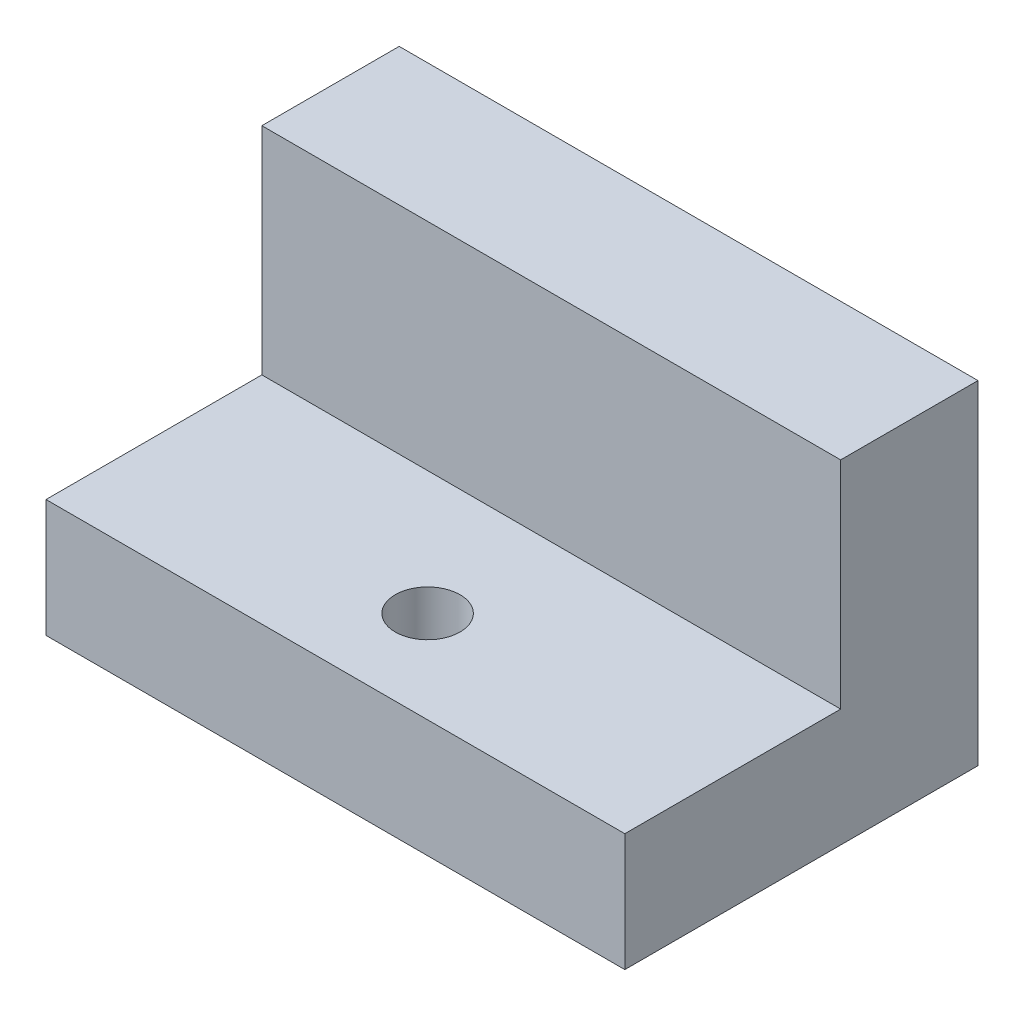
ISO-10303-21;
HEADER;
FILE_DESCRIPTION(('STEP AP214'),'2;1');
FILE_NAME('part.step','',(''),(''),'','','');
FILE_SCHEMA(('AUTOMOTIVE_DESIGN { 1 0 10303 214 1 1 1 1 }'));
ENDSEC;
DATA;
#1=APPLICATION_CONTEXT('core data for automotive mechanical design processes');
#2=APPLICATION_PROTOCOL_DEFINITION('international standard','automotive_design',2000,#1);
#3=PRODUCT_CONTEXT('',#1,'mechanical');
#4=PRODUCT('Part','Part','',(#3));
#5=PRODUCT_RELATED_PRODUCT_CATEGORY('part','',(#4));
#6=PRODUCT_DEFINITION_FORMATION('','',#4);
#7=PRODUCT_DEFINITION_CONTEXT('part definition',#1,'design');
#8=PRODUCT_DEFINITION('design','',#6,#7);
#9=PRODUCT_DEFINITION_SHAPE('','',#8);
#10=(LENGTH_UNIT() NAMED_UNIT(*) SI_UNIT(.MILLI.,.METRE.));
#11=(NAMED_UNIT(*) PLANE_ANGLE_UNIT() SI_UNIT($,.RADIAN.));
#12=(NAMED_UNIT(*) SI_UNIT($,.STERADIAN.) SOLID_ANGLE_UNIT());
#13=UNCERTAINTY_MEASURE_WITH_UNIT(LENGTH_MEASURE(1.E-05),#10,'distance_accuracy_value','');
#14=(GEOMETRIC_REPRESENTATION_CONTEXT(3) GLOBAL_UNCERTAINTY_ASSIGNED_CONTEXT((#13)) GLOBAL_UNIT_ASSIGNED_CONTEXT((#10,
#11,#12)) REPRESENTATION_CONTEXT('',''));
#15=CARTESIAN_POINT('',(0.,0.,0.));
#16=DIRECTION('',(0.,0.,1.));
#17=DIRECTION('',(1.,0.,0.));
#18=AXIS2_PLACEMENT_3D('',#15,#16,#17);
#19=CARTESIAN_POINT('',(-14.75,6.,0.));
#20=DIRECTION('',(-1.,0.,0.));
#21=DIRECTION('',(0.,0.,1.));
#22=AXIS2_PLACEMENT_3D('',#19,#20,#21);
#23=PLANE('',#22);
#24=DIRECTION('',(0.,0.,-1.));
#25=VECTOR('',#24,1.);
#26=CARTESIAN_POINT('',(-14.75,0.,0.));
#27=LINE('',#26,#25);
#28=CARTESIAN_POINT('',(-14.75,0.,4.));
#29=VERTEX_POINT('',#28);
#30=CARTESIAN_POINT('',(-14.75,0.,-14.));
#31=VERTEX_POINT('',#30);
#32=EDGE_CURVE('E89',#29,#31,#27,.T.);
#33=ORIENTED_EDGE('',*,*,#32,.F.);
#34=DIRECTION('',(0.,-1.,0.));
#35=VECTOR('',#34,1.);
#36=CARTESIAN_POINT('',(-14.75,6.,4.));
#37=LINE('',#36,#35);
#38=CARTESIAN_POINT('',(-14.75,6.,4.));
#39=VERTEX_POINT('',#38);
#40=EDGE_CURVE('E11',#39,#29,#37,.T.);
#41=ORIENTED_EDGE('',*,*,#40,.F.);
#42=DIRECTION('',(0.,0.,-1.));
#43=VECTOR('',#42,1.);
#44=CARTESIAN_POINT('',(-14.75,6.,0.));
#45=LINE('',#44,#43);
#46=CARTESIAN_POINT('',(-14.75,6.,-7.));
#47=VERTEX_POINT('',#46);
#48=EDGE_CURVE('E131',#39,#47,#45,.T.);
#49=ORIENTED_EDGE('',*,*,#48,.T.);
#50=DIRECTION('',(0.,-1.,0.));
#51=VECTOR('',#50,1.);
#52=CARTESIAN_POINT('',(-14.75,17.,-7.));
#53=LINE('',#52,#51);
#54=CARTESIAN_POINT('',(-14.75,17.,-7.));
#55=VERTEX_POINT('',#54);
#56=EDGE_CURVE('E116',#55,#47,#53,.T.);
#57=ORIENTED_EDGE('',*,*,#56,.F.);
#58=DIRECTION('',(0.,0.,1.));
#59=VECTOR('',#58,1.);
#60=CARTESIAN_POINT('',(-14.75,17.,-14.));
#61=LINE('',#60,#59);
#62=CARTESIAN_POINT('',(-14.75,17.,-14.));
#63=VERTEX_POINT('',#62);
#64=EDGE_CURVE('E92',#63,#55,#61,.T.);
#65=ORIENTED_EDGE('',*,*,#64,.F.);
#66=DIRECTION('',(0.,-1.,0.));
#67=VECTOR('',#66,1.);
#68=CARTESIAN_POINT('',(-14.75,6.,-14.));
#69=LINE('',#68,#67);
#70=EDGE_CURVE('E86',#63,#31,#69,.T.);
#71=ORIENTED_EDGE('',*,*,#70,.T.);
#72=EDGE_LOOP('',(#33,#41,#49,#57,#65,#71));
#73=FACE_BOUND('',#72,.T.);
#74=ADVANCED_FACE('F45',(#73),#23,.T.);
#75=CARTESIAN_POINT('',(0.,6.,4.));
#76=DIRECTION('',(0.,0.,-1.));
#77=DIRECTION('',(-1.,0.,0.));
#78=AXIS2_PLACEMENT_3D('',#75,#76,#77);
#79=PLANE('',#78);
#80=DIRECTION('',(1.,0.,0.));
#81=VECTOR('',#80,1.);
#82=CARTESIAN_POINT('',(0.,0.,4.));
#83=LINE('',#82,#81);
#84=CARTESIAN_POINT('',(14.75,0.,4.));
#85=VERTEX_POINT('',#84);
#86=EDGE_CURVE('E114',#29,#85,#83,.T.);
#87=ORIENTED_EDGE('',*,*,#86,.T.);
#88=DIRECTION('',(0.,-1.,0.));
#89=VECTOR('',#88,1.);
#90=CARTESIAN_POINT('',(14.75,6.,4.));
#91=LINE('',#90,#89);
#92=CARTESIAN_POINT('',(14.75,6.,4.));
#93=VERTEX_POINT('',#92);
#94=EDGE_CURVE('E53',#93,#85,#91,.T.);
#95=ORIENTED_EDGE('',*,*,#94,.F.);
#96=DIRECTION('',(1.,0.,0.));
#97=VECTOR('',#96,1.);
#98=CARTESIAN_POINT('',(0.,6.,4.));
#99=LINE('',#98,#97);
#100=EDGE_CURVE('E66',#39,#93,#99,.T.);
#101=ORIENTED_EDGE('',*,*,#100,.F.);
#102=ORIENTED_EDGE('',*,*,#40,.T.);
#103=EDGE_LOOP('',(#87,#95,#101,#102));
#104=FACE_BOUND('',#103,.T.);
#105=ADVANCED_FACE('F142',(#104),#79,.F.);
#106=CARTESIAN_POINT('',(14.75,6.,0.));
#107=DIRECTION('',(-1.,0.,0.));
#108=DIRECTION('',(0.,0.,1.));
#109=AXIS2_PLACEMENT_3D('',#106,#107,#108);
#110=PLANE('',#109);
#111=DIRECTION('',(0.,0.,-1.));
#112=VECTOR('',#111,1.);
#113=CARTESIAN_POINT('',(14.75,0.,0.));
#114=LINE('',#113,#112);
#115=CARTESIAN_POINT('',(14.75,0.,-14.));
#116=VERTEX_POINT('',#115);
#117=EDGE_CURVE('E109',#85,#116,#114,.T.);
#118=ORIENTED_EDGE('',*,*,#117,.T.);
#119=DIRECTION('',(0.,-1.,0.));
#120=VECTOR('',#119,1.);
#121=CARTESIAN_POINT('',(14.75,6.,-14.));
#122=LINE('',#121,#120);
#123=CARTESIAN_POINT('',(14.75,17.,-14.));
#124=VERTEX_POINT('',#123);
#125=EDGE_CURVE('E97',#124,#116,#122,.T.);
#126=ORIENTED_EDGE('',*,*,#125,.F.);
#127=DIRECTION('',(0.,0.,-1.));
#128=VECTOR('',#127,1.);
#129=CARTESIAN_POINT('',(14.75,17.,-14.));
#130=LINE('',#129,#128);
#131=CARTESIAN_POINT('',(14.75,17.,-7.));
#132=VERTEX_POINT('',#131);
#133=EDGE_CURVE('E159',#132,#124,#130,.T.);
#134=ORIENTED_EDGE('',*,*,#133,.F.);
#135=DIRECTION('',(0.,-1.,0.));
#136=VECTOR('',#135,1.);
#137=CARTESIAN_POINT('',(14.75,17.,-7.));
#138=LINE('',#137,#136);
#139=CARTESIAN_POINT('',(14.75,6.,-7.));
#140=VERTEX_POINT('',#139);
#141=EDGE_CURVE('E122',#132,#140,#138,.T.);
#142=ORIENTED_EDGE('',*,*,#141,.T.);
#143=DIRECTION('',(0.,0.,-1.));
#144=VECTOR('',#143,1.);
#145=CARTESIAN_POINT('',(14.75,6.,0.));
#146=LINE('',#145,#144);
#147=EDGE_CURVE('E140',#93,#140,#146,.T.);
#148=ORIENTED_EDGE('',*,*,#147,.F.);
#149=ORIENTED_EDGE('',*,*,#94,.T.);
#150=EDGE_LOOP('',(#118,#126,#134,#142,#148,#149));
#151=FACE_BOUND('',#150,.T.);
#152=ADVANCED_FACE('F138',(#151),#110,.F.);
#153=CARTESIAN_POINT('',(0.,6.,-14.));
#154=DIRECTION('',(0.,0.,1.));
#155=DIRECTION('',(1.,0.,0.));
#156=AXIS2_PLACEMENT_3D('',#153,#154,#155);
#157=PLANE('',#156);
#158=DIRECTION('',(-1.,0.,0.));
#159=VECTOR('',#158,1.);
#160=CARTESIAN_POINT('',(0.,0.,-14.));
#161=LINE('',#160,#159);
#162=EDGE_CURVE('E102',#116,#31,#161,.T.);
#163=ORIENTED_EDGE('',*,*,#162,.T.);
#164=ORIENTED_EDGE('',*,*,#70,.F.);
#165=DIRECTION('',(-1.,0.,0.));
#166=VECTOR('',#165,1.);
#167=CARTESIAN_POINT('',(-14.75,17.,-14.));
#168=LINE('',#167,#166);
#169=EDGE_CURVE('E162',#124,#63,#168,.T.);
#170=ORIENTED_EDGE('',*,*,#169,.F.);
#171=ORIENTED_EDGE('',*,*,#125,.T.);
#172=EDGE_LOOP('',(#163,#164,#170,#171));
#173=FACE_BOUND('',#172,.T.);
#174=ADVANCED_FACE('F103',(#173),#157,.F.);
#175=CARTESIAN_POINT('',(0.,6.,-0.700000000000001));
#176=DIRECTION('',(0.,-1.,0.));
#177=DIRECTION('',(0.,0.,-1.));
#178=AXIS2_PLACEMENT_3D('',#175,#176,#177);
#179=CYLINDRICAL_SURFACE('',#178,1.65);
#180=CARTESIAN_POINT('',(0.,6.,-0.700000000000001));
#181=DIRECTION('',(0.,1.,0.));
#182=DIRECTION('',(0.,0.,1.));
#183=AXIS2_PLACEMENT_3D('',#180,#181,#182);
#184=CIRCLE('',#183,1.65);
#185=CARTESIAN_POINT('',(0.,6.,0.949999999999999));
#186=VERTEX_POINT('',#185);
#187=EDGE_CURVE('E98',#186,#186,#184,.T.);
#188=ORIENTED_EDGE('',*,*,#187,.T.);
#189=EDGE_LOOP('',(#188));
#190=FACE_BOUND('',#189,.T.);
#191=CARTESIAN_POINT('',(0.,0.,-0.700000000000001));
#192=DIRECTION('',(0.,1.,0.));
#193=DIRECTION('',(0.,0.,1.));
#194=AXIS2_PLACEMENT_3D('',#191,#192,#193);
#195=CIRCLE('',#194,1.65);
#196=CARTESIAN_POINT('',(0.,0.,0.949999999999999));
#197=VERTEX_POINT('',#196);
#198=EDGE_CURVE('E108',#197,#197,#195,.T.);
#199=ORIENTED_EDGE('',*,*,#198,.F.);
#200=EDGE_LOOP('',(#199));
#201=FACE_BOUND('',#200,.T.);
#202=ADVANCED_FACE('F180',(#190,#201),#179,.F.);
#203=CARTESIAN_POINT('',(0.,6.,0.));
#204=DIRECTION('',(0.,1.,0.));
#205=DIRECTION('',(0.,0.,1.));
#206=AXIS2_PLACEMENT_3D('',#203,#204,#205);
#207=PLANE('',#206);
#208=DIRECTION('',(1.,0.,0.));
#209=VECTOR('',#208,1.);
#210=CARTESIAN_POINT('',(-14.75,6.,-7.));
#211=LINE('',#210,#209);
#212=EDGE_CURVE('E60',#47,#140,#211,.T.);
#213=ORIENTED_EDGE('',*,*,#212,.F.);
#214=ORIENTED_EDGE('',*,*,#48,.F.);
#215=ORIENTED_EDGE('',*,*,#100,.T.);
#216=ORIENTED_EDGE('',*,*,#147,.T.);
#217=EDGE_LOOP('',(#213,#214,#215,#216));
#218=FACE_BOUND('',#217,.T.);
#219=ORIENTED_EDGE('',*,*,#187,.F.);
#220=EDGE_LOOP('',(#219));
#221=FACE_BOUND('',#220,.T.);
#222=ADVANCED_FACE('F183',(#218,#221),#207,.T.);
#223=CARTESIAN_POINT('',(0.,0.,0.));
#224=DIRECTION('',(0.,1.,0.));
#225=DIRECTION('',(0.,0.,1.));
#226=AXIS2_PLACEMENT_3D('',#223,#224,#225);
#227=PLANE('',#226);
#228=ORIENTED_EDGE('',*,*,#32,.T.);
#229=ORIENTED_EDGE('',*,*,#162,.F.);
#230=ORIENTED_EDGE('',*,*,#117,.F.);
#231=ORIENTED_EDGE('',*,*,#86,.F.);
#232=EDGE_LOOP('',(#228,#229,#230,#231));
#233=FACE_BOUND('',#232,.T.);
#234=ORIENTED_EDGE('',*,*,#198,.T.);
#235=EDGE_LOOP('',(#234));
#236=FACE_BOUND('',#235,.T.);
#237=ADVANCED_FACE('F112',(#233,#236),#227,.F.);
#238=CARTESIAN_POINT('',(-14.75,17.,-7.));
#239=DIRECTION('',(0.,0.,-1.));
#240=DIRECTION('',(-1.,0.,0.));
#241=AXIS2_PLACEMENT_3D('',#238,#239,#240);
#242=PLANE('',#241);
#243=ORIENTED_EDGE('',*,*,#212,.T.);
#244=ORIENTED_EDGE('',*,*,#141,.F.);
#245=DIRECTION('',(1.,0.,0.));
#246=VECTOR('',#245,1.);
#247=CARTESIAN_POINT('',(-14.75,17.,-7.));
#248=LINE('',#247,#246);
#249=EDGE_CURVE('E152',#55,#132,#248,.T.);
#250=ORIENTED_EDGE('',*,*,#249,.F.);
#251=ORIENTED_EDGE('',*,*,#56,.T.);
#252=EDGE_LOOP('',(#243,#244,#250,#251));
#253=FACE_BOUND('',#252,.T.);
#254=ADVANCED_FACE('F148',(#253),#242,.F.);
#255=CARTESIAN_POINT('',(0.,17.,0.));
#256=DIRECTION('',(0.,1.,0.));
#257=DIRECTION('',(0.,0.,1.));
#258=AXIS2_PLACEMENT_3D('',#255,#256,#257);
#259=PLANE('',#258);
#260=ORIENTED_EDGE('',*,*,#64,.T.);
#261=ORIENTED_EDGE('',*,*,#249,.T.);
#262=ORIENTED_EDGE('',*,*,#133,.T.);
#263=ORIENTED_EDGE('',*,*,#169,.T.);
#264=EDGE_LOOP('',(#260,#261,#262,#263));
#265=FACE_BOUND('',#264,.T.);
#266=ADVANCED_FACE('F161',(#265),#259,.T.);
#267=CLOSED_SHELL('',(#74,#105,#152,#174,#202,#222,#237,#254,#266));
#268=MANIFOLD_SOLID_BREP('B2',#267);
#269=ADVANCED_BREP_SHAPE_REPRESENTATION('',(#18,#268),#14);
#270=SHAPE_DEFINITION_REPRESENTATION(#9,#269);
ENDSEC;
END-ISO-10303-21;
